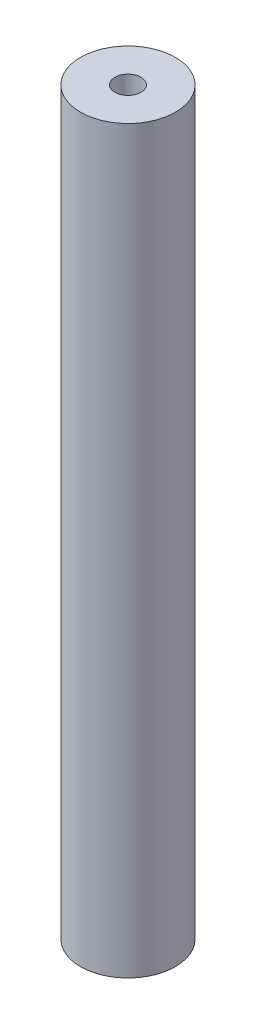
ISO-10303-21;
HEADER;
FILE_DESCRIPTION(('STEP AP214'),'2;1');
FILE_NAME('part.step','',(''),(''),'','','');
FILE_SCHEMA(('AUTOMOTIVE_DESIGN { 1 0 10303 214 1 1 1 1 }'));
ENDSEC;
DATA;
#1=APPLICATION_CONTEXT('core data for automotive mechanical design processes');
#2=APPLICATION_PROTOCOL_DEFINITION('international standard','automotive_design',2000,#1);
#3=PRODUCT_CONTEXT('',#1,'mechanical');
#4=PRODUCT('Part','Part','',(#3));
#5=PRODUCT_RELATED_PRODUCT_CATEGORY('part','',(#4));
#6=PRODUCT_DEFINITION_FORMATION('','',#4);
#7=PRODUCT_DEFINITION_CONTEXT('part definition',#1,'design');
#8=PRODUCT_DEFINITION('design','',#6,#7);
#9=PRODUCT_DEFINITION_SHAPE('','',#8);
#10=(LENGTH_UNIT() NAMED_UNIT(*) SI_UNIT(.MILLI.,.METRE.));
#11=(NAMED_UNIT(*) PLANE_ANGLE_UNIT() SI_UNIT($,.RADIAN.));
#12=(NAMED_UNIT(*) SI_UNIT($,.STERADIAN.) SOLID_ANGLE_UNIT());
#13=UNCERTAINTY_MEASURE_WITH_UNIT(LENGTH_MEASURE(1.E-05),#10,'distance_accuracy_value','');
#14=(GEOMETRIC_REPRESENTATION_CONTEXT(3) GLOBAL_UNCERTAINTY_ASSIGNED_CONTEXT((#13)) GLOBAL_UNIT_ASSIGNED_CONTEXT((#10,
#11,#12)) REPRESENTATION_CONTEXT('',''));
#15=CARTESIAN_POINT('',(0.,0.,0.));
#16=DIRECTION('',(0.,0.,1.));
#17=DIRECTION('',(1.,0.,0.));
#18=AXIS2_PLACEMENT_3D('',#15,#16,#17);
#19=CARTESIAN_POINT('',(0.,46.75,250.));
#20=DIRECTION('',(0.,1.,0.));
#21=DIRECTION('',(0.,0.,1.));
#22=AXIS2_PLACEMENT_3D('',#19,#20,#21);
#23=PLANE('',#22);
#24=CARTESIAN_POINT('',(0.,46.75,250.));
#25=DIRECTION('',(0.,1.,0.));
#26=DIRECTION('',(0.,0.,1.));
#27=AXIS2_PLACEMENT_3D('',#24,#25,#26);
#28=CIRCLE('',#27,6.);
#29=CARTESIAN_POINT('',(0.,46.75,256.));
#30=VERTEX_POINT('',#29);
#31=EDGE_CURVE('E10',#30,#30,#28,.T.);
#32=ORIENTED_EDGE('',*,*,#31,.T.);
#33=EDGE_LOOP('',(#32));
#34=FACE_BOUND('',#33,.T.);
#35=CARTESIAN_POINT('',(0.,46.75,250.));
#36=DIRECTION('',(0.,1.,0.));
#37=DIRECTION('',(0.,0.,1.));
#38=AXIS2_PLACEMENT_3D('',#35,#36,#37);
#39=CIRCLE('',#38,1.65);
#40=CARTESIAN_POINT('',(0.,46.75,251.65));
#41=VERTEX_POINT('',#40);
#42=EDGE_CURVE('E48',#41,#41,#39,.T.);
#43=ORIENTED_EDGE('',*,*,#42,.F.);
#44=EDGE_LOOP('',(#43));
#45=FACE_BOUND('',#44,.T.);
#46=ADVANCED_FACE('F40',(#34,#45),#23,.T.);
#47=CARTESIAN_POINT('',(0.,-46.75,250.));
#48=DIRECTION('',(0.,1.,0.));
#49=DIRECTION('',(0.,0.,1.));
#50=AXIS2_PLACEMENT_3D('',#47,#48,#49);
#51=PLANE('',#50);
#52=CARTESIAN_POINT('',(0.,-46.75,250.));
#53=DIRECTION('',(0.,1.,0.));
#54=DIRECTION('',(0.,0.,1.));
#55=AXIS2_PLACEMENT_3D('',#52,#53,#54);
#56=CIRCLE('',#55,6.);
#57=CARTESIAN_POINT('',(0.,-46.75,256.));
#58=VERTEX_POINT('',#57);
#59=EDGE_CURVE('E41',#58,#58,#56,.T.);
#60=ORIENTED_EDGE('',*,*,#59,.F.);
#61=EDGE_LOOP('',(#60));
#62=FACE_BOUND('',#61,.T.);
#63=CARTESIAN_POINT('',(0.,-46.75,250.));
#64=DIRECTION('',(0.,1.,0.));
#65=DIRECTION('',(0.,0.,1.));
#66=AXIS2_PLACEMENT_3D('',#63,#64,#65);
#67=CIRCLE('',#66,1.65);
#68=CARTESIAN_POINT('',(0.,-46.75,251.65));
#69=VERTEX_POINT('',#68);
#70=EDGE_CURVE('E49',#69,#69,#67,.T.);
#71=ORIENTED_EDGE('',*,*,#70,.T.);
#72=EDGE_LOOP('',(#71));
#73=FACE_BOUND('',#72,.T.);
#74=ADVANCED_FACE('F58',(#62,#73),#51,.F.);
#75=CARTESIAN_POINT('',(0.,46.75,250.));
#76=DIRECTION('',(0.,-1.,0.));
#77=DIRECTION('',(0.,0.,-1.));
#78=AXIS2_PLACEMENT_3D('',#75,#76,#77);
#79=CYLINDRICAL_SURFACE('',#78,6.);
#80=ORIENTED_EDGE('',*,*,#31,.F.);
#81=EDGE_LOOP('',(#80));
#82=FACE_BOUND('',#81,.T.);
#83=ORIENTED_EDGE('',*,*,#59,.T.);
#84=EDGE_LOOP('',(#83));
#85=FACE_BOUND('',#84,.T.);
#86=ADVANCED_FACE('F39',(#82,#85),#79,.T.);
#87=CARTESIAN_POINT('',(0.,46.75,250.));
#88=DIRECTION('',(0.,-1.,0.));
#89=DIRECTION('',(0.,0.,-1.));
#90=AXIS2_PLACEMENT_3D('',#87,#88,#89);
#91=CYLINDRICAL_SURFACE('',#90,1.65);
#92=ORIENTED_EDGE('',*,*,#42,.T.);
#93=EDGE_LOOP('',(#92));
#94=FACE_BOUND('',#93,.T.);
#95=ORIENTED_EDGE('',*,*,#70,.F.);
#96=EDGE_LOOP('',(#95));
#97=FACE_BOUND('',#96,.T.);
#98=ADVANCED_FACE('F57',(#94,#97),#91,.F.);
#99=CLOSED_SHELL('',(#46,#74,#86,#98));
#100=MANIFOLD_SOLID_BREP('B2',#99);
#101=ADVANCED_BREP_SHAPE_REPRESENTATION('',(#18,#100),#14);
#102=SHAPE_DEFINITION_REPRESENTATION(#9,#101);
ENDSEC;
END-ISO-10303-21;
